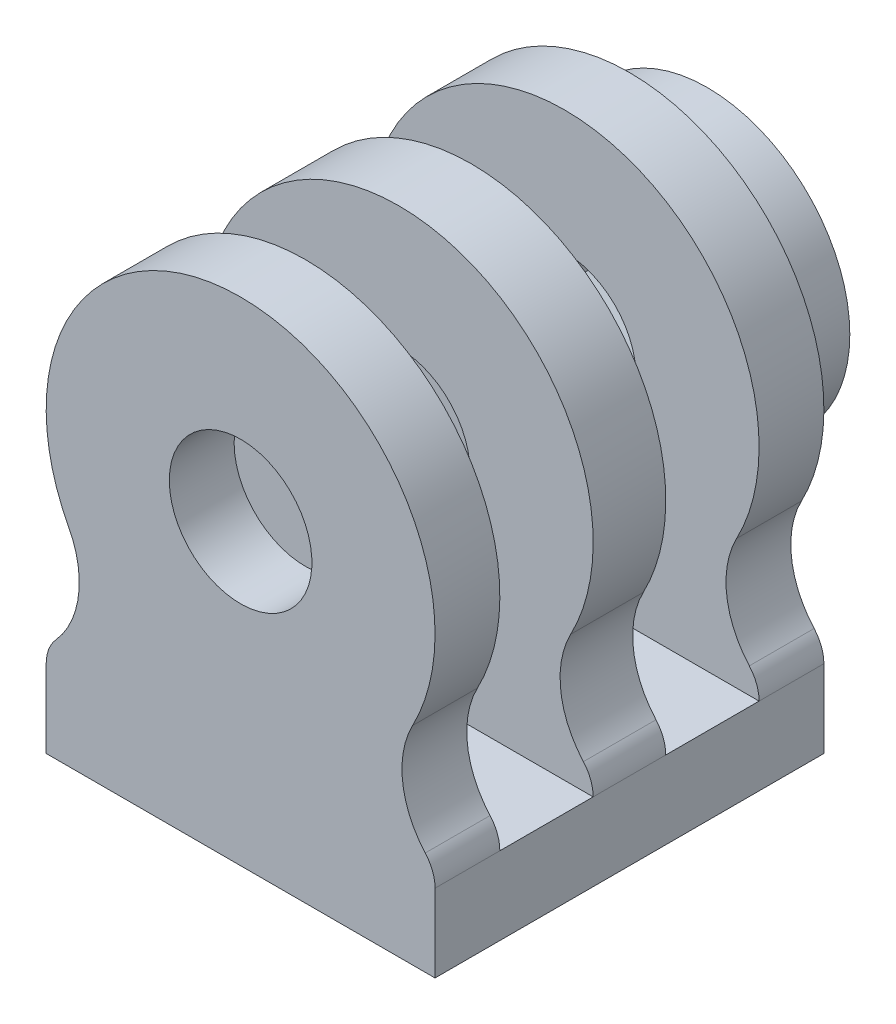
ISO-10303-21;
HEADER;
FILE_DESCRIPTION(('STEP AP214'),'2;1');
FILE_NAME('part.step','',(''),(''),'','','');
FILE_SCHEMA(('AUTOMOTIVE_DESIGN { 1 0 10303 214 1 1 1 1 }'));
ENDSEC;
DATA;
#1=APPLICATION_CONTEXT('core data for automotive mechanical design processes');
#2=APPLICATION_PROTOCOL_DEFINITION('international standard','automotive_design',2000,#1);
#3=PRODUCT_CONTEXT('',#1,'mechanical');
#4=PRODUCT('Part','Part','',(#3));
#5=PRODUCT_RELATED_PRODUCT_CATEGORY('part','',(#4));
#6=PRODUCT_DEFINITION_FORMATION('','',#4);
#7=PRODUCT_DEFINITION_CONTEXT('part definition',#1,'design');
#8=PRODUCT_DEFINITION('design','',#6,#7);
#9=PRODUCT_DEFINITION_SHAPE('','',#8);
#10=(LENGTH_UNIT() NAMED_UNIT(*) SI_UNIT(.MILLI.,.METRE.));
#11=(NAMED_UNIT(*) PLANE_ANGLE_UNIT() SI_UNIT($,.RADIAN.));
#12=(NAMED_UNIT(*) SI_UNIT($,.STERADIAN.) SOLID_ANGLE_UNIT());
#13=UNCERTAINTY_MEASURE_WITH_UNIT(LENGTH_MEASURE(1.E-05),#10,'distance_accuracy_value','');
#14=(GEOMETRIC_REPRESENTATION_CONTEXT(3) GLOBAL_UNCERTAINTY_ASSIGNED_CONTEXT((#13)) GLOBAL_UNIT_ASSIGNED_CONTEXT((#10,
#11,#12)) REPRESENTATION_CONTEXT('',''));
#15=CARTESIAN_POINT('',(0.,0.,0.));
#16=DIRECTION('',(0.,0.,1.));
#17=DIRECTION('',(1.,0.,0.));
#18=AXIS2_PLACEMENT_3D('',#15,#16,#17);
#19=CARTESIAN_POINT('',(0.,3.,0.));
#20=DIRECTION('',(1.,0.,0.));
#21=DIRECTION('',(0.,0.,-1.));
#22=AXIS2_PLACEMENT_3D('',#19,#20,#21);
#23=PLANE('',#22);
#24=DIRECTION('',(0.,0.,-1.));
#25=VECTOR('',#24,1.);
#26=CARTESIAN_POINT('',(0.,3.,0.));
#27=LINE('',#26,#25);
#28=CARTESIAN_POINT('',(0.,3.,-5.));
#29=VERTEX_POINT('',#28);
#30=CARTESIAN_POINT('',(0.,3.,-7.5));
#31=VERTEX_POINT('',#30);
#32=EDGE_CURVE('E378',#29,#31,#27,.T.);
#33=ORIENTED_EDGE('',*,*,#32,.T.);
#34=DIRECTION('',(0.,-1.,0.));
#35=VECTOR('',#34,1.);
#36=CARTESIAN_POINT('',(0.,3.,-7.5));
#37=LINE('',#36,#35);
#38=CARTESIAN_POINT('',(0.,0.,-7.5));
#39=VERTEX_POINT('',#38);
#40=EDGE_CURVE('E57',#31,#39,#37,.T.);
#41=ORIENTED_EDGE('',*,*,#40,.T.);
#42=DIRECTION('',(0.,0.,1.));
#43=VECTOR('',#42,1.);
#44=CARTESIAN_POINT('',(0.,0.,0.));
#45=LINE('',#44,#43);
#46=CARTESIAN_POINT('',(0.,0.,7.5));
#47=VERTEX_POINT('',#46);
#48=EDGE_CURVE('E412',#39,#47,#45,.T.);
#49=ORIENTED_EDGE('',*,*,#48,.T.);
#50=DIRECTION('',(0.,-1.,0.));
#51=VECTOR('',#50,1.);
#52=CARTESIAN_POINT('',(0.,3.,7.5));
#53=LINE('',#52,#51);
#54=CARTESIAN_POINT('',(0.,3.,7.5));
#55=VERTEX_POINT('',#54);
#56=EDGE_CURVE('E325',#55,#47,#53,.T.);
#57=ORIENTED_EDGE('',*,*,#56,.F.);
#58=DIRECTION('',(0.,0.,1.));
#59=VECTOR('',#58,1.);
#60=CARTESIAN_POINT('',(0.,3.,0.));
#61=LINE('',#60,#59);
#62=CARTESIAN_POINT('',(0.,3.,5.));
#63=VERTEX_POINT('',#62);
#64=EDGE_CURVE('E288',#63,#55,#61,.T.);
#65=ORIENTED_EDGE('',*,*,#64,.F.);
#66=DIRECTION('',(0.,0.,-1.));
#67=VECTOR('',#66,1.);
#68=CARTESIAN_POINT('',(0.,3.,0.));
#69=LINE('',#68,#67);
#70=CARTESIAN_POINT('',(0.,3.,1.4));
#71=VERTEX_POINT('',#70);
#72=EDGE_CURVE('E319',#63,#71,#69,.T.);
#73=ORIENTED_EDGE('',*,*,#72,.T.);
#74=CARTESIAN_POINT('',(0.,3.,-1.4));
#75=VERTEX_POINT('',#74);
#76=EDGE_CURVE('E375',#71,#75,#27,.T.);
#77=ORIENTED_EDGE('',*,*,#76,.T.);
#78=DIRECTION('',(0.,0.,1.));
#79=VECTOR('',#78,1.);
#80=CARTESIAN_POINT('',(0.,3.,0.));
#81=LINE('',#80,#79);
#82=EDGE_CURVE('E413',#29,#75,#81,.T.);
#83=ORIENTED_EDGE('',*,*,#82,.F.);
#84=EDGE_LOOP('',(#33,#41,#49,#57,#65,#73,#77,#83));
#85=FACE_BOUND('',#84,.T.);
#86=ADVANCED_FACE('F33',(#85),#23,.F.);
#87=CARTESIAN_POINT('',(0.,3.,-7.5));
#88=DIRECTION('',(0.,0.,1.));
#89=DIRECTION('',(1.,0.,0.));
#90=AXIS2_PLACEMENT_3D('',#87,#88,#89);
#91=PLANE('',#90);
#92=CARTESIAN_POINT('',(7.5,11.5,-7.5));
#93=DIRECTION('',(0.,0.,-1.));
#94=DIRECTION('',(-1.,0.,0.));
#95=AXIS2_PLACEMENT_3D('',#92,#93,#94);
#96=CIRCLE('',#95,5.5);
#97=CARTESIAN_POINT('',(2.,11.5,-7.5));
#98=VERTEX_POINT('',#97);
#99=EDGE_CURVE('E11',#98,#98,#96,.T.);
#100=ORIENTED_EDGE('',*,*,#99,.F.);
#101=EDGE_LOOP('',(#100));
#102=FACE_BOUND('',#101,.T.);
#103=CARTESIAN_POINT('',(17.2661170687802,6.34695859475442,-7.5));
#104=DIRECTION('',(0.,0.,-1.));
#105=DIRECTION('',(1.,0.,0.));
#106=AXIS2_PLACEMENT_3D('',#103,#104,#105);
#107=CIRCLE('',#106,3.54223158266911);
#108=CARTESIAN_POINT('',(14.6230502385342,3.98865362802261,-7.5));
#109=VERTEX_POINT('',#108);
#110=CARTESIAN_POINT('',(14.1332495807108,8.,-7.5));
#111=VERTEX_POINT('',#110);
#112=EDGE_CURVE('E352',#109,#111,#107,.T.);
#113=ORIENTED_EDGE('',*,*,#112,.F.);
#114=CARTESIAN_POINT('',(13.5150181359473,3.,-7.5));
#115=DIRECTION('',(0.,0.,1.));
#116=DIRECTION('',(-1.,0.,0.));
#117=AXIS2_PLACEMENT_3D('',#114,#115,#116);
#118=CIRCLE('',#117,1.48498186405268);
#119=CARTESIAN_POINT('',(15.,3.,-7.5));
#120=VERTEX_POINT('',#119);
#121=EDGE_CURVE('E363',#120,#109,#118,.T.);
#122=ORIENTED_EDGE('',*,*,#121,.F.);
#123=DIRECTION('',(0.,-1.,0.));
#124=VECTOR('',#123,1.);
#125=CARTESIAN_POINT('',(15.,3.,-7.5));
#126=LINE('',#125,#124);
#127=CARTESIAN_POINT('',(15.,0.,-7.5));
#128=VERTEX_POINT('',#127);
#129=EDGE_CURVE('E426',#120,#128,#126,.T.);
#130=ORIENTED_EDGE('',*,*,#129,.T.);
#131=DIRECTION('',(-1.,0.,0.));
#132=VECTOR('',#131,1.);
#133=CARTESIAN_POINT('',(0.,0.,-7.5));
#134=LINE('',#133,#132);
#135=EDGE_CURVE('E417',#128,#39,#134,.T.);
#136=ORIENTED_EDGE('',*,*,#135,.T.);
#137=ORIENTED_EDGE('',*,*,#40,.F.);
#138=CARTESIAN_POINT('',(1.48498186405268,3.,-7.5));
#139=DIRECTION('',(0.,0.,1.));
#140=DIRECTION('',(1.,0.,0.));
#141=AXIS2_PLACEMENT_3D('',#138,#139,#140);
#142=CIRCLE('',#141,1.48498186405268);
#143=CARTESIAN_POINT('',(0.376949761465803,3.98865362802261,-7.5));
#144=VERTEX_POINT('',#143);
#145=EDGE_CURVE('E361',#144,#31,#142,.T.);
#146=ORIENTED_EDGE('',*,*,#145,.F.);
#147=CARTESIAN_POINT('',(-2.26611706878019,6.34695859475442,-7.5));
#148=DIRECTION('',(0.,0.,-1.));
#149=DIRECTION('',(-1.,0.,0.));
#150=AXIS2_PLACEMENT_3D('',#147,#148,#149);
#151=CIRCLE('',#150,3.54223158266911);
#152=CARTESIAN_POINT('',(0.8667504192892,8.,-7.5));
#153=VERTEX_POINT('',#152);
#154=EDGE_CURVE('E358',#153,#144,#151,.T.);
#155=ORIENTED_EDGE('',*,*,#154,.F.);
#156=CARTESIAN_POINT('',(7.5,11.5,-7.5));
#157=DIRECTION('',(0.,0.,1.));
#158=DIRECTION('',(1.,0.,0.));
#159=AXIS2_PLACEMENT_3D('',#156,#157,#158);
#160=CIRCLE('',#159,7.5);
#161=EDGE_CURVE('E355',#111,#153,#160,.T.);
#162=ORIENTED_EDGE('',*,*,#161,.F.);
#163=EDGE_LOOP('',(#113,#122,#130,#136,#137,#146,#155,#162));
#164=FACE_BOUND('',#163,.T.);
#165=ADVANCED_FACE('F492',(#102,#164),#91,.F.);
#166=CARTESIAN_POINT('',(0.,19.,-5.));
#167=DIRECTION('',(0.,0.,-1.));
#168=DIRECTION('',(-1.,0.,0.));
#169=AXIS2_PLACEMENT_3D('',#166,#167,#168);
#170=PLANE('',#169);
#171=CARTESIAN_POINT('',(7.5,11.5,-5.));
#172=DIRECTION('',(0.,0.,-1.));
#173=DIRECTION('',(-1.,0.,0.));
#174=AXIS2_PLACEMENT_3D('',#171,#172,#173);
#175=CIRCLE('',#174,2.75);
#176=CARTESIAN_POINT('',(4.75,11.5,-5.));
#177=VERTEX_POINT('',#176);
#178=EDGE_CURVE('E349',#177,#177,#175,.T.);
#179=ORIENTED_EDGE('',*,*,#178,.T.);
#180=EDGE_LOOP('',(#179));
#181=FACE_BOUND('',#180,.T.);
#182=DIRECTION('',(1.,0.,0.));
#183=VECTOR('',#182,1.);
#184=CARTESIAN_POINT('',(0.,3.,-5.));
#185=LINE('',#184,#183);
#186=CARTESIAN_POINT('',(15.,3.,-5.));
#187=VERTEX_POINT('',#186);
#188=EDGE_CURVE('E409',#29,#187,#185,.T.);
#189=ORIENTED_EDGE('',*,*,#188,.T.);
#190=CARTESIAN_POINT('',(13.5150181359473,3.,-5.));
#191=DIRECTION('',(0.,0.,-1.));
#192=DIRECTION('',(-1.,0.,0.));
#193=AXIS2_PLACEMENT_3D('',#190,#191,#192);
#194=CIRCLE('',#193,1.48498186405268);
#195=CARTESIAN_POINT('',(14.6230502385342,3.98865362802261,-5.));
#196=VERTEX_POINT('',#195);
#197=EDGE_CURVE('E400',#187,#196,#194,.F.);
#198=ORIENTED_EDGE('',*,*,#197,.T.);
#199=CARTESIAN_POINT('',(17.2661170687802,6.34695859475442,-5.));
#200=DIRECTION('',(0.,0.,-1.));
#201=DIRECTION('',(-1.,0.,0.));
#202=AXIS2_PLACEMENT_3D('',#199,#200,#201);
#203=CIRCLE('',#202,3.54223158266911);
#204=CARTESIAN_POINT('',(14.1332495807108,8.,-5.));
#205=VERTEX_POINT('',#204);
#206=EDGE_CURVE('E403',#196,#205,#203,.T.);
#207=ORIENTED_EDGE('',*,*,#206,.T.);
#208=CARTESIAN_POINT('',(7.5,11.5,-5.));
#209=DIRECTION('',(0.,0.,-1.));
#210=DIRECTION('',(-1.,0.,0.));
#211=AXIS2_PLACEMENT_3D('',#208,#209,#210);
#212=CIRCLE('',#211,7.5);
#213=CARTESIAN_POINT('',(0.8667504192892,8.,-5.));
#214=VERTEX_POINT('',#213);
#215=EDGE_CURVE('E391',#205,#214,#212,.F.);
#216=ORIENTED_EDGE('',*,*,#215,.T.);
#217=CARTESIAN_POINT('',(-2.26611706878019,6.34695859475442,-5.));
#218=DIRECTION('',(0.,0.,-1.));
#219=DIRECTION('',(-1.,0.,0.));
#220=AXIS2_PLACEMENT_3D('',#217,#218,#219);
#221=CIRCLE('',#220,3.54223158266911);
#222=CARTESIAN_POINT('',(0.376949761465803,3.98865362802261,-5.));
#223=VERTEX_POINT('',#222);
#224=EDGE_CURVE('E394',#214,#223,#221,.T.);
#225=ORIENTED_EDGE('',*,*,#224,.T.);
#226=CARTESIAN_POINT('',(1.48498186405268,3.,-5.));
#227=DIRECTION('',(0.,0.,-1.));
#228=DIRECTION('',(-1.,0.,0.));
#229=AXIS2_PLACEMENT_3D('',#226,#227,#228);
#230=CIRCLE('',#229,1.48498186405268);
#231=EDGE_CURVE('E397',#223,#29,#230,.F.);
#232=ORIENTED_EDGE('',*,*,#231,.T.);
#233=EDGE_LOOP('',(#189,#198,#207,#216,#225,#232));
#234=FACE_BOUND('',#233,.T.);
#235=ADVANCED_FACE('F496',(#181,#234),#170,.F.);
#236=CARTESIAN_POINT('',(0.,19.,-1.4));
#237=DIRECTION('',(0.,0.,1.));
#238=DIRECTION('',(1.,0.,0.));
#239=AXIS2_PLACEMENT_3D('',#236,#237,#238);
#240=PLANE('',#239);
#241=CARTESIAN_POINT('',(7.5,11.5,-1.4));
#242=DIRECTION('',(0.,0.,1.));
#243=DIRECTION('',(1.,0.,0.));
#244=AXIS2_PLACEMENT_3D('',#241,#242,#243);
#245=CIRCLE('',#244,2.75);
#246=CARTESIAN_POINT('',(10.25,11.5,-1.4));
#247=VERTEX_POINT('',#246);
#248=EDGE_CURVE('E36',#247,#247,#245,.T.);
#249=ORIENTED_EDGE('',*,*,#248,.T.);
#250=EDGE_LOOP('',(#249));
#251=FACE_BOUND('',#250,.T.);
#252=CARTESIAN_POINT('',(17.2661170687802,6.34695859475442,-1.4));
#253=DIRECTION('',(0.,0.,1.));
#254=DIRECTION('',(1.,0.,0.));
#255=AXIS2_PLACEMENT_3D('',#252,#253,#254);
#256=CIRCLE('',#255,3.54223158266911);
#257=CARTESIAN_POINT('',(14.1332495807108,8.,-1.4));
#258=VERTEX_POINT('',#257);
#259=CARTESIAN_POINT('',(14.6230502385342,3.98865362802261,-1.4));
#260=VERTEX_POINT('',#259);
#261=EDGE_CURVE('E434',#258,#260,#256,.T.);
#262=ORIENTED_EDGE('',*,*,#261,.T.);
#263=CARTESIAN_POINT('',(13.5150181359473,3.,-1.4));
#264=DIRECTION('',(0.,0.,1.));
#265=DIRECTION('',(1.,0.,0.));
#266=AXIS2_PLACEMENT_3D('',#263,#264,#265);
#267=CIRCLE('',#266,1.48498186405268);
#268=CARTESIAN_POINT('',(15.,3.,-1.4));
#269=VERTEX_POINT('',#268);
#270=EDGE_CURVE('E41',#260,#269,#267,.F.);
#271=ORIENTED_EDGE('',*,*,#270,.T.);
#272=DIRECTION('',(-1.,0.,0.));
#273=VECTOR('',#272,1.);
#274=CARTESIAN_POINT('',(0.,3.,-1.4));
#275=LINE('',#274,#273);
#276=EDGE_CURVE('E406',#269,#75,#275,.T.);
#277=ORIENTED_EDGE('',*,*,#276,.T.);
#278=CARTESIAN_POINT('',(1.48498186405268,3.,-1.4));
#279=DIRECTION('',(0.,0.,1.));
#280=DIRECTION('',(1.,0.,0.));
#281=AXIS2_PLACEMENT_3D('',#278,#279,#280);
#282=CIRCLE('',#281,1.48498186405268);
#283=CARTESIAN_POINT('',(0.376949761465803,3.98865362802261,-1.4));
#284=VERTEX_POINT('',#283);
#285=EDGE_CURVE('E431',#75,#284,#282,.F.);
#286=ORIENTED_EDGE('',*,*,#285,.T.);
#287=CARTESIAN_POINT('',(-2.26611706878019,6.34695859475442,-1.4));
#288=DIRECTION('',(0.,0.,1.));
#289=DIRECTION('',(1.,0.,0.));
#290=AXIS2_PLACEMENT_3D('',#287,#288,#289);
#291=CIRCLE('',#290,3.54223158266911);
#292=CARTESIAN_POINT('',(0.8667504192892,8.,-1.4));
#293=VERTEX_POINT('',#292);
#294=EDGE_CURVE('E428',#284,#293,#291,.T.);
#295=ORIENTED_EDGE('',*,*,#294,.T.);
#296=CARTESIAN_POINT('',(7.5,11.5,-1.4));
#297=DIRECTION('',(0.,0.,1.));
#298=DIRECTION('',(1.,0.,0.));
#299=AXIS2_PLACEMENT_3D('',#296,#297,#298);
#300=CIRCLE('',#299,7.5);
#301=EDGE_CURVE('E370',#293,#258,#300,.F.);
#302=ORIENTED_EDGE('',*,*,#301,.T.);
#303=EDGE_LOOP('',(#262,#271,#277,#286,#295,#302));
#304=FACE_BOUND('',#303,.T.);
#305=ADVANCED_FACE('F439',(#251,#304),#240,.F.);
#306=CARTESIAN_POINT('',(0.,3.,0.));
#307=DIRECTION('',(0.,-1.,0.));
#308=DIRECTION('',(0.,0.,-1.));
#309=AXIS2_PLACEMENT_3D('',#306,#307,#308);
#310=PLANE('',#309);
#311=ORIENTED_EDGE('',*,*,#276,.F.);
#312=DIRECTION('',(0.,0.,-1.));
#313=VECTOR('',#312,1.);
#314=CARTESIAN_POINT('',(15.,3.,0.));
#315=LINE('',#314,#313);
#316=EDGE_CURVE('E416',#269,#187,#315,.T.);
#317=ORIENTED_EDGE('',*,*,#316,.T.);
#318=ORIENTED_EDGE('',*,*,#188,.F.);
#319=ORIENTED_EDGE('',*,*,#82,.T.);
#320=EDGE_LOOP('',(#311,#317,#318,#319));
#321=FACE_BOUND('',#320,.T.);
#322=ADVANCED_FACE('F450',(#321),#310,.F.);
#323=CARTESIAN_POINT('',(15.,3.,0.));
#324=DIRECTION('',(-1.,0.,0.));
#325=DIRECTION('',(0.,0.,1.));
#326=AXIS2_PLACEMENT_3D('',#323,#324,#325);
#327=PLANE('',#326);
#328=ORIENTED_EDGE('',*,*,#129,.F.);
#329=DIRECTION('',(0.,0.,-1.));
#330=VECTOR('',#329,1.);
#331=CARTESIAN_POINT('',(15.,3.,0.));
#332=LINE('',#331,#330);
#333=EDGE_CURVE('E374',#187,#120,#332,.T.);
#334=ORIENTED_EDGE('',*,*,#333,.F.);
#335=ORIENTED_EDGE('',*,*,#316,.F.);
#336=CARTESIAN_POINT('',(15.,3.,1.4));
#337=VERTEX_POINT('',#336);
#338=EDGE_CURVE('E372',#337,#269,#332,.T.);
#339=ORIENTED_EDGE('',*,*,#338,.F.);
#340=DIRECTION('',(0.,0.,1.));
#341=VECTOR('',#340,1.);
#342=CARTESIAN_POINT('',(15.,3.,0.));
#343=LINE('',#342,#341);
#344=CARTESIAN_POINT('',(15.,3.,5.));
#345=VERTEX_POINT('',#344);
#346=EDGE_CURVE('E322',#337,#345,#343,.T.);
#347=ORIENTED_EDGE('',*,*,#346,.T.);
#348=DIRECTION('',(0.,0.,1.));
#349=VECTOR('',#348,1.);
#350=CARTESIAN_POINT('',(15.,3.,0.));
#351=LINE('',#350,#349);
#352=CARTESIAN_POINT('',(15.,3.,7.5));
#353=VERTEX_POINT('',#352);
#354=EDGE_CURVE('E286',#345,#353,#351,.T.);
#355=ORIENTED_EDGE('',*,*,#354,.T.);
#356=DIRECTION('',(0.,-1.,0.));
#357=VECTOR('',#356,1.);
#358=CARTESIAN_POINT('',(15.,3.,7.5));
#359=LINE('',#358,#357);
#360=CARTESIAN_POINT('',(15.,0.,7.5));
#361=VERTEX_POINT('',#360);
#362=EDGE_CURVE('E330',#353,#361,#359,.T.);
#363=ORIENTED_EDGE('',*,*,#362,.T.);
#364=DIRECTION('',(0.,0.,-1.));
#365=VECTOR('',#364,1.);
#366=CARTESIAN_POINT('',(15.,0.,0.));
#367=LINE('',#366,#365);
#368=EDGE_CURVE('E421',#361,#128,#367,.T.);
#369=ORIENTED_EDGE('',*,*,#368,.T.);
#370=EDGE_LOOP('',(#328,#334,#335,#339,#347,#355,#363,#369));
#371=FACE_BOUND('',#370,.T.);
#372=ADVANCED_FACE('F446',(#371),#327,.F.);
#373=CARTESIAN_POINT('',(0.,0.,0.));
#374=DIRECTION('',(0.,-1.,0.));
#375=DIRECTION('',(0.,0.,-1.));
#376=AXIS2_PLACEMENT_3D('',#373,#374,#375);
#377=PLANE('',#376);
#378=ORIENTED_EDGE('',*,*,#48,.F.);
#379=ORIENTED_EDGE('',*,*,#135,.F.);
#380=ORIENTED_EDGE('',*,*,#368,.F.);
#381=DIRECTION('',(-1.,0.,0.));
#382=VECTOR('',#381,1.);
#383=CARTESIAN_POINT('',(0.,0.,7.5));
#384=LINE('',#383,#382);
#385=EDGE_CURVE('E318',#361,#47,#384,.T.);
#386=ORIENTED_EDGE('',*,*,#385,.T.);
#387=EDGE_LOOP('',(#378,#379,#380,#386));
#388=FACE_BOUND('',#387,.T.);
#389=ADVANCED_FACE('F474',(#388),#377,.T.);
#390=CARTESIAN_POINT('',(13.5150181359473,3.,0.));
#391=DIRECTION('',(0.,0.,-1.));
#392=DIRECTION('',(-1.,0.,0.));
#393=AXIS2_PLACEMENT_3D('',#390,#391,#392);
#394=CYLINDRICAL_SURFACE('',#393,1.48498186405268);
#395=DIRECTION('',(0.,0.,-1.));
#396=VECTOR('',#395,1.);
#397=CARTESIAN_POINT('',(14.6230502385342,3.98865362802261,0.));
#398=LINE('',#397,#396);
#399=CARTESIAN_POINT('',(14.6230502385342,3.98865362802261,1.4));
#400=VERTEX_POINT('',#399);
#401=EDGE_CURVE('E367',#400,#260,#398,.T.);
#402=ORIENTED_EDGE('',*,*,#401,.F.);
#403=CARTESIAN_POINT('',(13.5150181359473,3.,1.4));
#404=DIRECTION('',(0.,0.,1.));
#405=DIRECTION('',(1.,0.,0.));
#406=AXIS2_PLACEMENT_3D('',#403,#404,#405);
#407=CIRCLE('',#406,1.48498186405268);
#408=EDGE_CURVE('E342',#400,#337,#407,.F.);
#409=ORIENTED_EDGE('',*,*,#408,.T.);
#410=ORIENTED_EDGE('',*,*,#338,.T.);
#411=ORIENTED_EDGE('',*,*,#270,.F.);
#412=EDGE_LOOP('',(#402,#409,#410,#411));
#413=FACE_BOUND('',#412,.T.);
#414=ADVANCED_FACE('F472',(#413),#394,.T.);
#415=CARTESIAN_POINT('',(7.5,11.5,0.));
#416=DIRECTION('',(0.,0.,-1.));
#417=DIRECTION('',(-1.,0.,0.));
#418=AXIS2_PLACEMENT_3D('',#415,#416,#417);
#419=CYLINDRICAL_SURFACE('',#418,7.5);
#420=ORIENTED_EDGE('',*,*,#301,.F.);
#421=DIRECTION('',(0.,0.,-1.));
#422=VECTOR('',#421,1.);
#423=CARTESIAN_POINT('',(0.8667504192892,8.,0.));
#424=LINE('',#423,#422);
#425=CARTESIAN_POINT('',(0.8667504192892,8.,1.4));
#426=VERTEX_POINT('',#425);
#427=EDGE_CURVE('E383',#426,#293,#424,.T.);
#428=ORIENTED_EDGE('',*,*,#427,.F.);
#429=CARTESIAN_POINT('',(7.5,11.5,1.4));
#430=DIRECTION('',(0.,0.,1.));
#431=DIRECTION('',(1.,0.,0.));
#432=AXIS2_PLACEMENT_3D('',#429,#430,#431);
#433=CIRCLE('',#432,7.5);
#434=CARTESIAN_POINT('',(14.1332495807108,8.,1.4));
#435=VERTEX_POINT('',#434);
#436=EDGE_CURVE('E285',#426,#435,#433,.F.);
#437=ORIENTED_EDGE('',*,*,#436,.T.);
#438=DIRECTION('',(0.,0.,-1.));
#439=VECTOR('',#438,1.);
#440=CARTESIAN_POINT('',(14.1332495807108,8.,0.));
#441=LINE('',#440,#439);
#442=EDGE_CURVE('E387',#435,#258,#441,.T.);
#443=ORIENTED_EDGE('',*,*,#442,.T.);
#444=EDGE_LOOP('',(#420,#428,#437,#443));
#445=FACE_BOUND('',#444,.T.);
#446=ADVANCED_FACE('F471',(#445),#419,.T.);
#447=CARTESIAN_POINT('',(-2.26611706878019,6.34695859475442,0.));
#448=DIRECTION('',(0.,0.,-1.));
#449=DIRECTION('',(-1.,0.,0.));
#450=AXIS2_PLACEMENT_3D('',#447,#448,#449);
#451=CYLINDRICAL_SURFACE('',#450,3.54223158266911);
#452=DIRECTION('',(0.,0.,-1.));
#453=VECTOR('',#452,1.);
#454=CARTESIAN_POINT('',(0.376949761465803,3.98865362802261,0.));
#455=LINE('',#454,#453);
#456=CARTESIAN_POINT('',(0.376949761465803,3.98865362802261,1.4));
#457=VERTEX_POINT('',#456);
#458=EDGE_CURVE('E379',#457,#284,#455,.T.);
#459=ORIENTED_EDGE('',*,*,#458,.F.);
#460=CARTESIAN_POINT('',(-2.26611706878019,6.34695859475442,1.4));
#461=DIRECTION('',(0.,0.,1.));
#462=DIRECTION('',(1.,0.,0.));
#463=AXIS2_PLACEMENT_3D('',#460,#461,#462);
#464=CIRCLE('',#463,3.54223158266911);
#465=EDGE_CURVE('E333',#457,#426,#464,.T.);
#466=ORIENTED_EDGE('',*,*,#465,.T.);
#467=ORIENTED_EDGE('',*,*,#427,.T.);
#468=ORIENTED_EDGE('',*,*,#294,.F.);
#469=EDGE_LOOP('',(#459,#466,#467,#468));
#470=FACE_BOUND('',#469,.T.);
#471=ADVANCED_FACE('F467',(#470),#451,.F.);
#472=CARTESIAN_POINT('',(1.48498186405268,3.,0.));
#473=DIRECTION('',(0.,0.,-1.));
#474=DIRECTION('',(-1.,0.,0.));
#475=AXIS2_PLACEMENT_3D('',#472,#473,#474);
#476=CYLINDRICAL_SURFACE('',#475,1.48498186405268);
#477=ORIENTED_EDGE('',*,*,#76,.F.);
#478=CARTESIAN_POINT('',(1.48498186405268,3.,1.4));
#479=DIRECTION('',(0.,0.,1.));
#480=DIRECTION('',(1.,0.,0.));
#481=AXIS2_PLACEMENT_3D('',#478,#479,#480);
#482=CIRCLE('',#481,1.48498186405268);
#483=EDGE_CURVE('E336',#71,#457,#482,.F.);
#484=ORIENTED_EDGE('',*,*,#483,.T.);
#485=ORIENTED_EDGE('',*,*,#458,.T.);
#486=ORIENTED_EDGE('',*,*,#285,.F.);
#487=EDGE_LOOP('',(#477,#484,#485,#486));
#488=FACE_BOUND('',#487,.T.);
#489=ADVANCED_FACE('F455',(#488),#476,.T.);
#490=CARTESIAN_POINT('',(17.2661170687802,6.34695859475442,0.));
#491=DIRECTION('',(0.,0.,-1.));
#492=DIRECTION('',(-1.,0.,0.));
#493=AXIS2_PLACEMENT_3D('',#490,#491,#492);
#494=CYLINDRICAL_SURFACE('',#493,3.54223158266911);
#495=ORIENTED_EDGE('',*,*,#442,.F.);
#496=CARTESIAN_POINT('',(17.2661170687802,6.34695859475442,1.4));
#497=DIRECTION('',(0.,0.,1.));
#498=DIRECTION('',(1.,0.,0.));
#499=AXIS2_PLACEMENT_3D('',#496,#497,#498);
#500=CIRCLE('',#499,3.54223158266911);
#501=EDGE_CURVE('E339',#435,#400,#500,.T.);
#502=ORIENTED_EDGE('',*,*,#501,.T.);
#503=ORIENTED_EDGE('',*,*,#401,.T.);
#504=ORIENTED_EDGE('',*,*,#261,.F.);
#505=EDGE_LOOP('',(#495,#502,#503,#504));
#506=FACE_BOUND('',#505,.T.);
#507=ADVANCED_FACE('F470',(#506),#494,.F.);
#508=EDGE_CURVE('E371',#196,#109,#398,.T.);
#509=ORIENTED_EDGE('',*,*,#508,.T.);
#510=ORIENTED_EDGE('',*,*,#112,.T.);
#511=EDGE_CURVE('E366',#205,#111,#441,.T.);
#512=ORIENTED_EDGE('',*,*,#511,.F.);
#513=ORIENTED_EDGE('',*,*,#206,.F.);
#514=EDGE_LOOP('',(#509,#510,#512,#513));
#515=FACE_BOUND('',#514,.T.);
#516=ADVANCED_FACE('F489',(#515),#494,.F.);
#517=ORIENTED_EDGE('',*,*,#333,.T.);
#518=ORIENTED_EDGE('',*,*,#121,.T.);
#519=ORIENTED_EDGE('',*,*,#508,.F.);
#520=ORIENTED_EDGE('',*,*,#197,.F.);
#521=EDGE_LOOP('',(#517,#518,#519,#520));
#522=FACE_BOUND('',#521,.T.);
#523=ADVANCED_FACE('F476',(#522),#394,.T.);
#524=EDGE_CURVE('E382',#223,#144,#455,.T.);
#525=ORIENTED_EDGE('',*,*,#524,.T.);
#526=ORIENTED_EDGE('',*,*,#145,.T.);
#527=ORIENTED_EDGE('',*,*,#32,.F.);
#528=ORIENTED_EDGE('',*,*,#231,.F.);
#529=EDGE_LOOP('',(#525,#526,#527,#528));
#530=FACE_BOUND('',#529,.T.);
#531=ADVANCED_FACE('F488',(#530),#476,.T.);
#532=EDGE_CURVE('E386',#214,#153,#424,.T.);
#533=ORIENTED_EDGE('',*,*,#532,.T.);
#534=ORIENTED_EDGE('',*,*,#154,.T.);
#535=ORIENTED_EDGE('',*,*,#524,.F.);
#536=ORIENTED_EDGE('',*,*,#224,.F.);
#537=EDGE_LOOP('',(#533,#534,#535,#536));
#538=FACE_BOUND('',#537,.T.);
#539=ADVANCED_FACE('F522',(#538),#451,.F.);
#540=ORIENTED_EDGE('',*,*,#161,.T.);
#541=ORIENTED_EDGE('',*,*,#532,.F.);
#542=ORIENTED_EDGE('',*,*,#215,.F.);
#543=ORIENTED_EDGE('',*,*,#511,.T.);
#544=EDGE_LOOP('',(#540,#541,#542,#543));
#545=FACE_BOUND('',#544,.T.);
#546=ADVANCED_FACE('F482',(#545),#419,.T.);
#547=CARTESIAN_POINT('',(7.5,11.5,0.));
#548=DIRECTION('',(0.,0.,-1.));
#549=DIRECTION('',(-1.,0.,0.));
#550=AXIS2_PLACEMENT_3D('',#547,#548,#549);
#551=CYLINDRICAL_SURFACE('',#550,2.75);
#552=ORIENTED_EDGE('',*,*,#248,.F.);
#553=EDGE_LOOP('',(#552));
#554=FACE_BOUND('',#553,.T.);
#555=CARTESIAN_POINT('',(7.5,11.5,1.4));
#556=DIRECTION('',(0.,0.,1.));
#557=DIRECTION('',(1.,0.,0.));
#558=AXIS2_PLACEMENT_3D('',#555,#556,#557);
#559=CIRCLE('',#558,2.75);
#560=CARTESIAN_POINT('',(10.25,11.5,1.4));
#561=VERTEX_POINT('',#560);
#562=EDGE_CURVE('E264',#561,#561,#559,.T.);
#563=ORIENTED_EDGE('',*,*,#562,.T.);
#564=EDGE_LOOP('',(#563));
#565=FACE_BOUND('',#564,.T.);
#566=ADVANCED_FACE('F521',(#554,#565),#551,.F.);
#567=CARTESIAN_POINT('',(7.5,11.5,-7.5));
#568=DIRECTION('',(0.,0.,-1.));
#569=DIRECTION('',(-1.,0.,0.));
#570=AXIS2_PLACEMENT_3D('',#567,#568,#569);
#571=CIRCLE('',#570,2.75);
#572=CARTESIAN_POINT('',(4.75,11.5,-7.5));
#573=VERTEX_POINT('',#572);
#574=EDGE_CURVE('E257',#573,#573,#571,.T.);
#575=ORIENTED_EDGE('',*,*,#574,.T.);
#576=EDGE_LOOP('',(#575));
#577=FACE_BOUND('',#576,.T.);
#578=ORIENTED_EDGE('',*,*,#178,.F.);
#579=EDGE_LOOP('',(#578));
#580=FACE_BOUND('',#579,.T.);
#581=ADVANCED_FACE('F570',(#577,#580),#551,.F.);
#582=CARTESIAN_POINT('',(0.,3.,7.5));
#583=DIRECTION('',(0.,0.,-1.));
#584=DIRECTION('',(1.,0.,0.));
#585=AXIS2_PLACEMENT_3D('',#582,#583,#584);
#586=PLANE('',#585);
#587=CARTESIAN_POINT('',(7.5,11.5,7.5));
#588=DIRECTION('',(0.,0.,-1.));
#589=DIRECTION('',(-1.,0.,0.));
#590=AXIS2_PLACEMENT_3D('',#587,#588,#589);
#591=CIRCLE('',#590,2.75);
#592=CARTESIAN_POINT('',(4.75,11.5,7.5));
#593=VERTEX_POINT('',#592);
#594=EDGE_CURVE('E260',#593,#593,#591,.T.);
#595=ORIENTED_EDGE('',*,*,#594,.T.);
#596=EDGE_LOOP('',(#595));
#597=FACE_BOUND('',#596,.T.);
#598=CARTESIAN_POINT('',(17.2661170687802,6.34695859475442,7.5));
#599=DIRECTION('',(0.,0.,-1.));
#600=DIRECTION('',(1.,0.,0.));
#601=AXIS2_PLACEMENT_3D('',#598,#599,#600);
#602=CIRCLE('',#601,3.54223158266911);
#603=CARTESIAN_POINT('',(14.6230502385342,3.98865362802261,7.5));
#604=VERTEX_POINT('',#603);
#605=CARTESIAN_POINT('',(14.1332495807108,8.,7.5));
#606=VERTEX_POINT('',#605);
#607=EDGE_CURVE('E268',#604,#606,#602,.T.);
#608=ORIENTED_EDGE('',*,*,#607,.T.);
#609=CARTESIAN_POINT('',(7.5,11.5,7.5));
#610=DIRECTION('',(0.,0.,1.));
#611=DIRECTION('',(1.,0.,0.));
#612=AXIS2_PLACEMENT_3D('',#609,#610,#611);
#613=CIRCLE('',#612,7.5);
#614=CARTESIAN_POINT('',(0.8667504192892,8.,7.5));
#615=VERTEX_POINT('',#614);
#616=EDGE_CURVE('E271',#606,#615,#613,.T.);
#617=ORIENTED_EDGE('',*,*,#616,.T.);
#618=CARTESIAN_POINT('',(-2.26611706878019,6.34695859475442,7.5));
#619=DIRECTION('',(0.,0.,-1.));
#620=DIRECTION('',(-1.,0.,0.));
#621=AXIS2_PLACEMENT_3D('',#618,#619,#620);
#622=CIRCLE('',#621,3.54223158266911);
#623=CARTESIAN_POINT('',(0.376949761465803,3.98865362802261,7.5));
#624=VERTEX_POINT('',#623);
#625=EDGE_CURVE('E274',#615,#624,#622,.T.);
#626=ORIENTED_EDGE('',*,*,#625,.T.);
#627=CARTESIAN_POINT('',(1.48498186405268,3.,7.5));
#628=DIRECTION('',(0.,0.,1.));
#629=DIRECTION('',(1.,0.,0.));
#630=AXIS2_PLACEMENT_3D('',#627,#628,#629);
#631=CIRCLE('',#630,1.48498186405268);
#632=EDGE_CURVE('E277',#624,#55,#631,.T.);
#633=ORIENTED_EDGE('',*,*,#632,.T.);
#634=ORIENTED_EDGE('',*,*,#56,.T.);
#635=ORIENTED_EDGE('',*,*,#385,.F.);
#636=ORIENTED_EDGE('',*,*,#362,.F.);
#637=CARTESIAN_POINT('',(13.5150181359473,3.,7.5));
#638=DIRECTION('',(0.,0.,1.));
#639=DIRECTION('',(-1.,0.,0.));
#640=AXIS2_PLACEMENT_3D('',#637,#638,#639);
#641=CIRCLE('',#640,1.48498186405268);
#642=EDGE_CURVE('E279',#353,#604,#641,.T.);
#643=ORIENTED_EDGE('',*,*,#642,.T.);
#644=EDGE_LOOP('',(#608,#617,#626,#633,#634,#635,#636,#643));
#645=FACE_BOUND('',#644,.T.);
#646=ADVANCED_FACE('F575',(#597,#645),#586,.F.);
#647=CARTESIAN_POINT('',(0.,19.,5.));
#648=DIRECTION('',(0.,0.,1.));
#649=DIRECTION('',(-1.,0.,0.));
#650=AXIS2_PLACEMENT_3D('',#647,#648,#649);
#651=PLANE('',#650);
#652=CARTESIAN_POINT('',(7.5,11.5,5.));
#653=DIRECTION('',(0.,0.,-1.));
#654=DIRECTION('',(-1.,0.,0.));
#655=AXIS2_PLACEMENT_3D('',#652,#653,#654);
#656=CIRCLE('',#655,2.75);
#657=CARTESIAN_POINT('',(4.75,11.5,5.));
#658=VERTEX_POINT('',#657);
#659=EDGE_CURVE('E265',#658,#658,#656,.T.);
#660=ORIENTED_EDGE('',*,*,#659,.F.);
#661=EDGE_LOOP('',(#660));
#662=FACE_BOUND('',#661,.T.);
#663=DIRECTION('',(1.,0.,0.));
#664=VECTOR('',#663,1.);
#665=CARTESIAN_POINT('',(0.,3.,5.));
#666=LINE('',#665,#664);
#667=EDGE_CURVE('E315',#63,#345,#666,.T.);
#668=ORIENTED_EDGE('',*,*,#667,.F.);
#669=CARTESIAN_POINT('',(1.48498186405268,3.,5.));
#670=DIRECTION('',(0.,0.,-1.));
#671=DIRECTION('',(-1.,0.,0.));
#672=AXIS2_PLACEMENT_3D('',#669,#670,#671);
#673=CIRCLE('',#672,1.48498186405268);
#674=CARTESIAN_POINT('',(0.376949761465803,3.98865362802261,5.));
#675=VERTEX_POINT('',#674);
#676=EDGE_CURVE('E304',#675,#63,#673,.F.);
#677=ORIENTED_EDGE('',*,*,#676,.F.);
#678=CARTESIAN_POINT('',(-2.26611706878019,6.34695859475442,5.));
#679=DIRECTION('',(0.,0.,-1.));
#680=DIRECTION('',(-1.,0.,0.));
#681=AXIS2_PLACEMENT_3D('',#678,#679,#680);
#682=CIRCLE('',#681,3.54223158266911);
#683=CARTESIAN_POINT('',(0.8667504192892,8.,5.));
#684=VERTEX_POINT('',#683);
#685=EDGE_CURVE('E301',#684,#675,#682,.T.);
#686=ORIENTED_EDGE('',*,*,#685,.F.);
#687=CARTESIAN_POINT('',(7.5,11.5,5.));
#688=DIRECTION('',(0.,0.,-1.));
#689=DIRECTION('',(-1.,0.,0.));
#690=AXIS2_PLACEMENT_3D('',#687,#688,#689);
#691=CIRCLE('',#690,7.5);
#692=CARTESIAN_POINT('',(14.1332495807108,8.,5.));
#693=VERTEX_POINT('',#692);
#694=EDGE_CURVE('E298',#693,#684,#691,.F.);
#695=ORIENTED_EDGE('',*,*,#694,.F.);
#696=CARTESIAN_POINT('',(17.2661170687802,6.34695859475442,5.));
#697=DIRECTION('',(0.,0.,-1.));
#698=DIRECTION('',(-1.,0.,0.));
#699=AXIS2_PLACEMENT_3D('',#696,#697,#698);
#700=CIRCLE('',#699,3.54223158266911);
#701=CARTESIAN_POINT('',(14.6230502385342,3.98865362802261,5.));
#702=VERTEX_POINT('',#701);
#703=EDGE_CURVE('E309',#702,#693,#700,.T.);
#704=ORIENTED_EDGE('',*,*,#703,.F.);
#705=CARTESIAN_POINT('',(13.5150181359473,3.,5.));
#706=DIRECTION('',(0.,0.,-1.));
#707=DIRECTION('',(-1.,0.,0.));
#708=AXIS2_PLACEMENT_3D('',#705,#706,#707);
#709=CIRCLE('',#708,1.48498186405268);
#710=EDGE_CURVE('E306',#345,#702,#709,.F.);
#711=ORIENTED_EDGE('',*,*,#710,.F.);
#712=EDGE_LOOP('',(#668,#677,#686,#695,#704,#711));
#713=FACE_BOUND('',#712,.T.);
#714=ADVANCED_FACE('F767',(#662,#713),#651,.F.);
#715=CARTESIAN_POINT('',(0.,19.,1.4));
#716=DIRECTION('',(0.,0.,-1.));
#717=DIRECTION('',(1.,0.,0.));
#718=AXIS2_PLACEMENT_3D('',#715,#716,#717);
#719=PLANE('',#718);
#720=ORIENTED_EDGE('',*,*,#562,.F.);
#721=EDGE_LOOP('',(#720));
#722=FACE_BOUND('',#721,.T.);
#723=ORIENTED_EDGE('',*,*,#501,.F.);
#724=ORIENTED_EDGE('',*,*,#436,.F.);
#725=ORIENTED_EDGE('',*,*,#465,.F.);
#726=ORIENTED_EDGE('',*,*,#483,.F.);
#727=DIRECTION('',(-1.,0.,0.));
#728=VECTOR('',#727,1.);
#729=CARTESIAN_POINT('',(0.,3.,1.4));
#730=LINE('',#729,#728);
#731=EDGE_CURVE('E312',#337,#71,#730,.T.);
#732=ORIENTED_EDGE('',*,*,#731,.F.);
#733=ORIENTED_EDGE('',*,*,#408,.F.);
#734=EDGE_LOOP('',(#723,#724,#725,#726,#732,#733));
#735=FACE_BOUND('',#734,.T.);
#736=ADVANCED_FACE('F464',(#722,#735),#719,.F.);
#737=CARTESIAN_POINT('',(0.,3.,0.));
#738=DIRECTION('',(0.,-1.,0.));
#739=DIRECTION('',(0.,0.,1.));
#740=AXIS2_PLACEMENT_3D('',#737,#738,#739);
#741=PLANE('',#740);
#742=ORIENTED_EDGE('',*,*,#731,.T.);
#743=ORIENTED_EDGE('',*,*,#72,.F.);
#744=ORIENTED_EDGE('',*,*,#667,.T.);
#745=ORIENTED_EDGE('',*,*,#346,.F.);
#746=EDGE_LOOP('',(#742,#743,#744,#745));
#747=FACE_BOUND('',#746,.T.);
#748=ADVANCED_FACE('F460',(#747),#741,.F.);
#749=CARTESIAN_POINT('',(17.2661170687802,6.34695859475442,0.));
#750=DIRECTION('',(0.,0.,1.));
#751=DIRECTION('',(-1.,0.,0.));
#752=AXIS2_PLACEMENT_3D('',#749,#750,#751);
#753=CYLINDRICAL_SURFACE('',#752,3.54223158266911);
#754=DIRECTION('',(0.,0.,1.));
#755=VECTOR('',#754,1.);
#756=CARTESIAN_POINT('',(14.6230502385342,3.98865362802261,0.));
#757=LINE('',#756,#755);
#758=EDGE_CURVE('E283',#702,#604,#757,.T.);
#759=ORIENTED_EDGE('',*,*,#758,.F.);
#760=ORIENTED_EDGE('',*,*,#703,.T.);
#761=DIRECTION('',(0.,0.,1.));
#762=VECTOR('',#761,1.);
#763=CARTESIAN_POINT('',(14.1332495807108,8.,0.));
#764=LINE('',#763,#762);
#765=EDGE_CURVE('E282',#693,#606,#764,.T.);
#766=ORIENTED_EDGE('',*,*,#765,.T.);
#767=ORIENTED_EDGE('',*,*,#607,.F.);
#768=EDGE_LOOP('',(#759,#760,#766,#767));
#769=FACE_BOUND('',#768,.T.);
#770=ADVANCED_FACE('F750',(#769),#753,.F.);
#771=CARTESIAN_POINT('',(13.5150181359473,3.,0.));
#772=DIRECTION('',(0.,0.,1.));
#773=DIRECTION('',(-1.,0.,0.));
#774=AXIS2_PLACEMENT_3D('',#771,#772,#773);
#775=CYLINDRICAL_SURFACE('',#774,1.48498186405268);
#776=ORIENTED_EDGE('',*,*,#354,.F.);
#777=ORIENTED_EDGE('',*,*,#710,.T.);
#778=ORIENTED_EDGE('',*,*,#758,.T.);
#779=ORIENTED_EDGE('',*,*,#642,.F.);
#780=EDGE_LOOP('',(#776,#777,#778,#779));
#781=FACE_BOUND('',#780,.T.);
#782=ADVANCED_FACE('F746',(#781),#775,.T.);
#783=CARTESIAN_POINT('',(1.48498186405268,3.,0.));
#784=DIRECTION('',(0.,0.,1.));
#785=DIRECTION('',(-1.,0.,0.));
#786=AXIS2_PLACEMENT_3D('',#783,#784,#785);
#787=CYLINDRICAL_SURFACE('',#786,1.48498186405268);
#788=DIRECTION('',(0.,0.,1.));
#789=VECTOR('',#788,1.);
#790=CARTESIAN_POINT('',(0.376949761465803,3.98865362802261,0.));
#791=LINE('',#790,#789);
#792=EDGE_CURVE('E291',#675,#624,#791,.T.);
#793=ORIENTED_EDGE('',*,*,#792,.F.);
#794=ORIENTED_EDGE('',*,*,#676,.T.);
#795=ORIENTED_EDGE('',*,*,#64,.T.);
#796=ORIENTED_EDGE('',*,*,#632,.F.);
#797=EDGE_LOOP('',(#793,#794,#795,#796));
#798=FACE_BOUND('',#797,.T.);
#799=ADVANCED_FACE('F749',(#798),#787,.T.);
#800=CARTESIAN_POINT('',(-2.26611706878019,6.34695859475442,0.));
#801=DIRECTION('',(0.,0.,1.));
#802=DIRECTION('',(-1.,0.,0.));
#803=AXIS2_PLACEMENT_3D('',#800,#801,#802);
#804=CYLINDRICAL_SURFACE('',#803,3.54223158266911);
#805=DIRECTION('',(0.,0.,1.));
#806=VECTOR('',#805,1.);
#807=CARTESIAN_POINT('',(0.8667504192892,8.,0.));
#808=LINE('',#807,#806);
#809=EDGE_CURVE('E293',#684,#615,#808,.T.);
#810=ORIENTED_EDGE('',*,*,#809,.F.);
#811=ORIENTED_EDGE('',*,*,#685,.T.);
#812=ORIENTED_EDGE('',*,*,#792,.T.);
#813=ORIENTED_EDGE('',*,*,#625,.F.);
#814=EDGE_LOOP('',(#810,#811,#812,#813));
#815=FACE_BOUND('',#814,.T.);
#816=ADVANCED_FACE('F754',(#815),#804,.F.);
#817=CARTESIAN_POINT('',(7.5,11.5,0.));
#818=DIRECTION('',(0.,0.,1.));
#819=DIRECTION('',(-1.,0.,0.));
#820=AXIS2_PLACEMENT_3D('',#817,#818,#819);
#821=CYLINDRICAL_SURFACE('',#820,7.5);
#822=ORIENTED_EDGE('',*,*,#616,.F.);
#823=ORIENTED_EDGE('',*,*,#765,.F.);
#824=ORIENTED_EDGE('',*,*,#694,.T.);
#825=ORIENTED_EDGE('',*,*,#809,.T.);
#826=EDGE_LOOP('',(#822,#823,#824,#825));
#827=FACE_BOUND('',#826,.T.);
#828=ADVANCED_FACE('F744',(#827),#821,.T.);
#829=CARTESIAN_POINT('',(7.5,11.5,0.));
#830=DIRECTION('',(0.,0.,1.));
#831=DIRECTION('',(-1.,0.,0.));
#832=AXIS2_PLACEMENT_3D('',#829,#830,#831);
#833=CYLINDRICAL_SURFACE('',#832,2.75);
#834=ORIENTED_EDGE('',*,*,#594,.F.);
#835=EDGE_LOOP('',(#834));
#836=FACE_BOUND('',#835,.T.);
#837=ORIENTED_EDGE('',*,*,#659,.T.);
#838=EDGE_LOOP('',(#837));
#839=FACE_BOUND('',#838,.T.);
#840=ADVANCED_FACE('F655',(#836,#839),#833,.F.);
#841=CARTESIAN_POINT('',(7.5,11.5,-10.5));
#842=DIRECTION('',(0.,0.,-1.));
#843=DIRECTION('',(-1.,0.,0.));
#844=AXIS2_PLACEMENT_3D('',#841,#842,#843);
#845=PLANE('',#844);
#846=DIRECTION('',(0.,1.,0.));
#847=VECTOR('',#846,1.);
#848=CARTESIAN_POINT('',(3.5,9.1905989232415,-10.5));
#849=LINE('',#848,#847);
#850=CARTESIAN_POINT('',(3.5,9.1905989232415,-10.5));
#851=VERTEX_POINT('',#850);
#852=CARTESIAN_POINT('',(3.5,13.8094010767585,-10.5));
#853=VERTEX_POINT('',#852);
#854=EDGE_CURVE('E225',#851,#853,#849,.T.);
#855=ORIENTED_EDGE('',*,*,#854,.F.);
#856=DIRECTION('',(-0.866025403784439,0.5,0.));
#857=VECTOR('',#856,1.);
#858=CARTESIAN_POINT('',(7.5,6.88119784648299,-10.5));
#859=LINE('',#858,#857);
#860=CARTESIAN_POINT('',(7.5,6.88119784648299,-10.5));
#861=VERTEX_POINT('',#860);
#862=EDGE_CURVE('E238',#861,#851,#859,.T.);
#863=ORIENTED_EDGE('',*,*,#862,.F.);
#864=DIRECTION('',(-0.866025403784439,-0.5,0.));
#865=VECTOR('',#864,1.);
#866=CARTESIAN_POINT('',(11.5,9.1905989232415,-10.5));
#867=LINE('',#866,#865);
#868=CARTESIAN_POINT('',(11.5,9.1905989232415,-10.5));
#869=VERTEX_POINT('',#868);
#870=EDGE_CURVE('E49',#869,#861,#867,.T.);
#871=ORIENTED_EDGE('',*,*,#870,.F.);
#872=DIRECTION('',(0.,-1.,0.));
#873=VECTOR('',#872,1.);
#874=CARTESIAN_POINT('',(11.5,13.8094010767585,-10.5));
#875=LINE('',#874,#873);
#876=CARTESIAN_POINT('',(11.5,13.8094010767585,-10.5));
#877=VERTEX_POINT('',#876);
#878=EDGE_CURVE('E234',#877,#869,#875,.T.);
#879=ORIENTED_EDGE('',*,*,#878,.F.);
#880=DIRECTION('',(0.866025403784439,-0.5,0.));
#881=VECTOR('',#880,1.);
#882=CARTESIAN_POINT('',(7.5,16.118802153517,-10.5));
#883=LINE('',#882,#881);
#884=CARTESIAN_POINT('',(7.5,16.118802153517,-10.5));
#885=VERTEX_POINT('',#884);
#886=EDGE_CURVE('E909',#885,#877,#883,.T.);
#887=ORIENTED_EDGE('',*,*,#886,.F.);
#888=DIRECTION('',(0.866025403784439,0.5,0.));
#889=VECTOR('',#888,1.);
#890=CARTESIAN_POINT('',(3.5,13.8094010767585,-10.5));
#891=LINE('',#890,#889);
#892=EDGE_CURVE('E908',#853,#885,#891,.T.);
#893=ORIENTED_EDGE('',*,*,#892,.F.);
#894=EDGE_LOOP('',(#855,#863,#871,#879,#887,#893));
#895=FACE_BOUND('',#894,.T.);
#896=CARTESIAN_POINT('',(7.5,11.5,-10.5));
#897=DIRECTION('',(0.,0.,-1.));
#898=DIRECTION('',(-1.,0.,0.));
#899=AXIS2_PLACEMENT_3D('',#896,#897,#898);
#900=CIRCLE('',#899,5.5);
#901=CARTESIAN_POINT('',(2.,11.5,-10.5));
#902=VERTEX_POINT('',#901);
#903=EDGE_CURVE('E258',#902,#902,#900,.T.);
#904=ORIENTED_EDGE('',*,*,#903,.T.);
#905=EDGE_LOOP('',(#904));
#906=FACE_BOUND('',#905,.T.);
#907=ADVANCED_FACE('F665',(#895,#906),#845,.T.);
#908=CARTESIAN_POINT('',(7.5,11.5,-10.5));
#909=DIRECTION('',(0.,0.,1.));
#910=DIRECTION('',(1.,0.,0.));
#911=AXIS2_PLACEMENT_3D('',#908,#909,#910);
#912=CYLINDRICAL_SURFACE('',#911,5.5);
#913=ORIENTED_EDGE('',*,*,#903,.F.);
#914=EDGE_LOOP('',(#913));
#915=FACE_BOUND('',#914,.T.);
#916=ORIENTED_EDGE('',*,*,#99,.T.);
#917=EDGE_LOOP('',(#916));
#918=FACE_BOUND('',#917,.T.);
#919=ADVANCED_FACE('F660',(#915,#918),#912,.T.);
#920=CARTESIAN_POINT('',(0.,3.,-7.5));
#921=DIRECTION('',(0.,0.,1.));
#922=DIRECTION('',(1.,0.,0.));
#923=AXIS2_PLACEMENT_3D('',#920,#921,#922);
#924=PLANE('',#923);
#925=DIRECTION('',(-0.866025403784439,0.5,0.));
#926=VECTOR('',#925,1.);
#927=CARTESIAN_POINT('',(7.5,6.88119784648299,-7.5));
#928=LINE('',#927,#926);
#929=CARTESIAN_POINT('',(7.5,6.88119784648299,-7.5));
#930=VERTEX_POINT('',#929);
#931=CARTESIAN_POINT('',(3.5,9.1905989232415,-7.5));
#932=VERTEX_POINT('',#931);
#933=EDGE_CURVE('E231',#930,#932,#928,.T.);
#934=ORIENTED_EDGE('',*,*,#933,.T.);
#935=DIRECTION('',(0.,1.,0.));
#936=VECTOR('',#935,1.);
#937=CARTESIAN_POINT('',(3.5,9.1905989232415,-7.5));
#938=LINE('',#937,#936);
#939=CARTESIAN_POINT('',(3.5,13.8094010767585,-7.5));
#940=VERTEX_POINT('',#939);
#941=EDGE_CURVE('E222',#932,#940,#938,.T.);
#942=ORIENTED_EDGE('',*,*,#941,.T.);
#943=DIRECTION('',(0.866025403784439,0.5,0.));
#944=VECTOR('',#943,1.);
#945=CARTESIAN_POINT('',(3.5,13.8094010767585,-7.5));
#946=LINE('',#945,#944);
#947=CARTESIAN_POINT('',(7.5,16.118802153517,-7.5));
#948=VERTEX_POINT('',#947);
#949=EDGE_CURVE('E209',#940,#948,#946,.T.);
#950=ORIENTED_EDGE('',*,*,#949,.T.);
#951=DIRECTION('',(0.866025403784439,-0.5,0.));
#952=VECTOR('',#951,1.);
#953=CARTESIAN_POINT('',(7.5,16.118802153517,-7.5));
#954=LINE('',#953,#952);
#955=CARTESIAN_POINT('',(11.5,13.8094010767585,-7.5));
#956=VERTEX_POINT('',#955);
#957=EDGE_CURVE('E250',#948,#956,#954,.T.);
#958=ORIENTED_EDGE('',*,*,#957,.T.);
#959=DIRECTION('',(0.,-1.,0.));
#960=VECTOR('',#959,1.);
#961=CARTESIAN_POINT('',(11.5,13.8094010767585,-7.5));
#962=LINE('',#961,#960);
#963=CARTESIAN_POINT('',(11.5,9.1905989232415,-7.5));
#964=VERTEX_POINT('',#963);
#965=EDGE_CURVE('E246',#956,#964,#962,.T.);
#966=ORIENTED_EDGE('',*,*,#965,.T.);
#967=DIRECTION('',(-0.866025403784439,-0.5,0.));
#968=VECTOR('',#967,1.);
#969=CARTESIAN_POINT('',(11.5,9.1905989232415,-7.5));
#970=LINE('',#969,#968);
#971=EDGE_CURVE('E243',#964,#930,#970,.T.);
#972=ORIENTED_EDGE('',*,*,#971,.T.);
#973=EDGE_LOOP('',(#934,#942,#950,#958,#966,#972));
#974=FACE_BOUND('',#973,.T.);
#975=ORIENTED_EDGE('',*,*,#574,.F.);
#976=EDGE_LOOP('',(#975));
#977=FACE_BOUND('',#976,.T.);
#978=ADVANCED_FACE('F228',(#974,#977),#924,.F.);
#979=CARTESIAN_POINT('',(3.5,9.1905989232415,4.72020185321557));
#980=DIRECTION('',(-1.,0.,0.));
#981=DIRECTION('',(0.,-1.,0.));
#982=AXIS2_PLACEMENT_3D('',#979,#980,#981);
#983=PLANE('',#982);
#984=DIRECTION('',(0.,0.,-1.));
#985=VECTOR('',#984,1.);
#986=CARTESIAN_POINT('',(3.5,9.1905989232415,4.72020185321557));
#987=LINE('',#986,#985);
#988=EDGE_CURVE('E241',#932,#851,#987,.T.);
#989=ORIENTED_EDGE('',*,*,#988,.T.);
#990=ORIENTED_EDGE('',*,*,#854,.T.);
#991=DIRECTION('',(0.,0.,-1.));
#992=VECTOR('',#991,1.);
#993=CARTESIAN_POINT('',(3.5,13.8094010767585,4.72020185321557));
#994=LINE('',#993,#992);
#995=EDGE_CURVE('E213',#940,#853,#994,.T.);
#996=ORIENTED_EDGE('',*,*,#995,.F.);
#997=ORIENTED_EDGE('',*,*,#941,.F.);
#998=EDGE_LOOP('',(#989,#990,#996,#997));
#999=FACE_BOUND('',#998,.T.);
#1000=ADVANCED_FACE('F221',(#999),#983,.F.);
#1001=CARTESIAN_POINT('',(3.5,13.8094010767585,4.72020185321557));
#1002=DIRECTION('',(-0.5,0.866025403784438,0.));
#1003=DIRECTION('',(-0.866025403784439,-0.5,0.));
#1004=AXIS2_PLACEMENT_3D('',#1001,#1002,#1003);
#1005=PLANE('',#1004);
#1006=ORIENTED_EDGE('',*,*,#995,.T.);
#1007=ORIENTED_EDGE('',*,*,#892,.T.);
#1008=DIRECTION('',(0.,0.,-1.));
#1009=VECTOR('',#1008,1.);
#1010=CARTESIAN_POINT('',(7.5,16.118802153517,4.72020185321557));
#1011=LINE('',#1010,#1009);
#1012=EDGE_CURVE('E215',#948,#885,#1011,.T.);
#1013=ORIENTED_EDGE('',*,*,#1012,.F.);
#1014=ORIENTED_EDGE('',*,*,#949,.F.);
#1015=EDGE_LOOP('',(#1006,#1007,#1013,#1014));
#1016=FACE_BOUND('',#1015,.T.);
#1017=ADVANCED_FACE('F211',(#1016),#1005,.F.);
#1018=CARTESIAN_POINT('',(7.5,16.118802153517,4.72020185321557));
#1019=DIRECTION('',(0.5,0.866025403784439,0.));
#1020=DIRECTION('',(-0.866025403784439,0.5,0.));
#1021=AXIS2_PLACEMENT_3D('',#1018,#1019,#1020);
#1022=PLANE('',#1021);
#1023=ORIENTED_EDGE('',*,*,#1012,.T.);
#1024=ORIENTED_EDGE('',*,*,#886,.T.);
#1025=DIRECTION('',(0.,0.,-1.));
#1026=VECTOR('',#1025,1.);
#1027=CARTESIAN_POINT('',(11.5,13.8094010767585,4.72020185321557));
#1028=LINE('',#1027,#1026);
#1029=EDGE_CURVE('E249',#956,#877,#1028,.T.);
#1030=ORIENTED_EDGE('',*,*,#1029,.F.);
#1031=ORIENTED_EDGE('',*,*,#957,.F.);
#1032=EDGE_LOOP('',(#1023,#1024,#1030,#1031));
#1033=FACE_BOUND('',#1032,.T.);
#1034=ADVANCED_FACE('F700',(#1033),#1022,.F.);
#1035=CARTESIAN_POINT('',(11.5,13.8094010767585,4.72020185321557));
#1036=DIRECTION('',(1.,0.,0.));
#1037=DIRECTION('',(0.,0.,-1.));
#1038=AXIS2_PLACEMENT_3D('',#1035,#1036,#1037);
#1039=PLANE('',#1038);
#1040=ORIENTED_EDGE('',*,*,#1029,.T.);
#1041=ORIENTED_EDGE('',*,*,#878,.T.);
#1042=DIRECTION('',(0.,0.,-1.));
#1043=VECTOR('',#1042,1.);
#1044=CARTESIAN_POINT('',(11.5,9.1905989232415,4.72020185321557));
#1045=LINE('',#1044,#1043);
#1046=EDGE_CURVE('E245',#964,#869,#1045,.T.);
#1047=ORIENTED_EDGE('',*,*,#1046,.F.);
#1048=ORIENTED_EDGE('',*,*,#965,.F.);
#1049=EDGE_LOOP('',(#1040,#1041,#1047,#1048));
#1050=FACE_BOUND('',#1049,.T.);
#1051=ADVANCED_FACE('F709',(#1050),#1039,.F.);
#1052=CARTESIAN_POINT('',(11.5,9.1905989232415,4.72020185321557));
#1053=DIRECTION('',(0.5,-0.866025403784438,0.));
#1054=DIRECTION('',(0.866025403784439,0.5,0.));
#1055=AXIS2_PLACEMENT_3D('',#1052,#1053,#1054);
#1056=PLANE('',#1055);
#1057=ORIENTED_EDGE('',*,*,#1046,.T.);
#1058=ORIENTED_EDGE('',*,*,#870,.T.);
#1059=DIRECTION('',(0.,0.,-1.));
#1060=VECTOR('',#1059,1.);
#1061=CARTESIAN_POINT('',(7.5,6.88119784648299,4.72020185321557));
#1062=LINE('',#1061,#1060);
#1063=EDGE_CURVE('E242',#930,#861,#1062,.T.);
#1064=ORIENTED_EDGE('',*,*,#1063,.F.);
#1065=ORIENTED_EDGE('',*,*,#971,.F.);
#1066=EDGE_LOOP('',(#1057,#1058,#1064,#1065));
#1067=FACE_BOUND('',#1066,.T.);
#1068=ADVANCED_FACE('F719',(#1067),#1056,.F.);
#1069=CARTESIAN_POINT('',(7.5,6.88119784648299,4.72020185321557));
#1070=DIRECTION('',(-0.5,-0.866025403784439,0.));
#1071=DIRECTION('',(0.866025403784439,-0.5,0.));
#1072=AXIS2_PLACEMENT_3D('',#1069,#1070,#1071);
#1073=PLANE('',#1072);
#1074=ORIENTED_EDGE('',*,*,#1063,.T.);
#1075=ORIENTED_EDGE('',*,*,#862,.T.);
#1076=ORIENTED_EDGE('',*,*,#988,.F.);
#1077=ORIENTED_EDGE('',*,*,#933,.F.);
#1078=EDGE_LOOP('',(#1074,#1075,#1076,#1077));
#1079=FACE_BOUND('',#1078,.T.);
#1080=ADVANCED_FACE('F729',(#1079),#1073,.F.);
#1081=CLOSED_SHELL('',(#86,#165,#235,#305,#322,#372,#389,#414,#446,#471,#489,#507,#516,#523,
#531,#539,#546,#566,#581,#646,#714,#736,#748,#770,#782,#799,#816,#828,#840,#907,#919,#978,#1000,
#1017,#1034,#1051,#1068,#1080));
#1082=MANIFOLD_SOLID_BREP('B2',#1081);
#1083=ADVANCED_BREP_SHAPE_REPRESENTATION('',(#18,#1082),#14);
#1084=SHAPE_DEFINITION_REPRESENTATION(#9,#1083);
ENDSEC;
END-ISO-10303-21;
